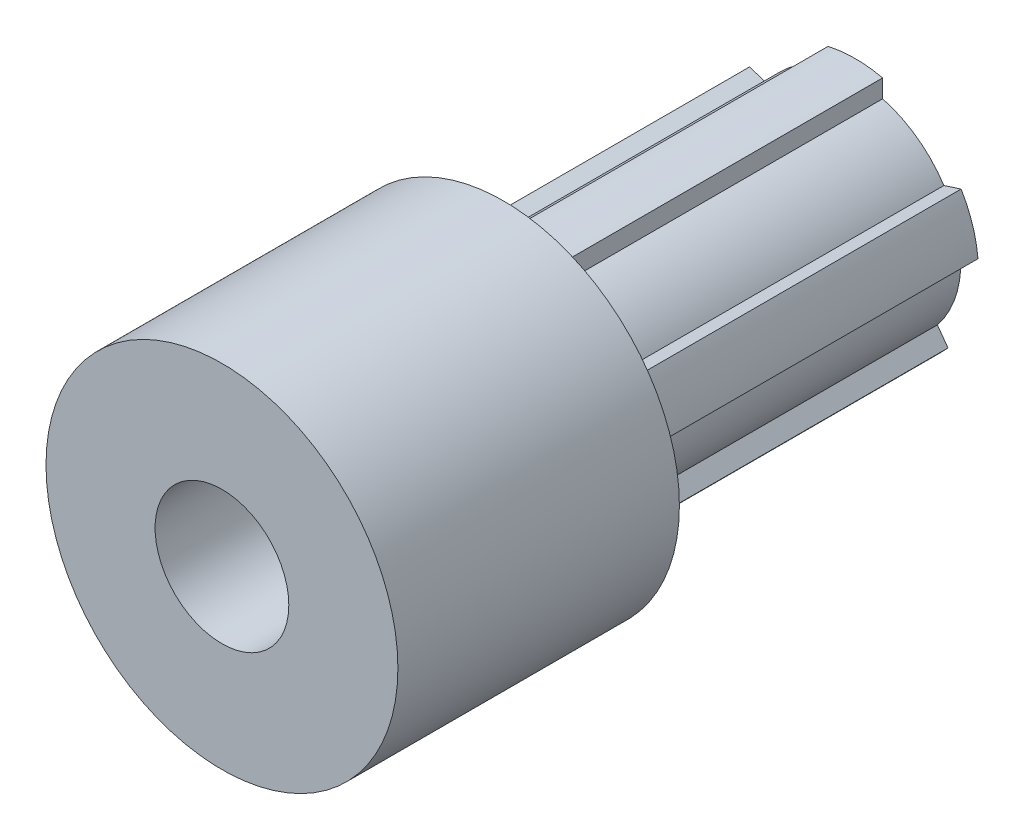
ISO-10303-21;
HEADER;
FILE_DESCRIPTION(('STEP AP214'),'2;1');
FILE_NAME('part.step','',(''),(''),'','','');
FILE_SCHEMA(('AUTOMOTIVE_DESIGN { 1 0 10303 214 1 1 1 1 }'));
ENDSEC;
DATA;
#1=APPLICATION_CONTEXT('core data for automotive mechanical design processes');
#2=APPLICATION_PROTOCOL_DEFINITION('international standard','automotive_design',2000,#1);
#3=PRODUCT_CONTEXT('',#1,'mechanical');
#4=PRODUCT('Part','Part','',(#3));
#5=PRODUCT_RELATED_PRODUCT_CATEGORY('part','',(#4));
#6=PRODUCT_DEFINITION_FORMATION('','',#4);
#7=PRODUCT_DEFINITION_CONTEXT('part definition',#1,'design');
#8=PRODUCT_DEFINITION('design','',#6,#7);
#9=PRODUCT_DEFINITION_SHAPE('','',#8);
#10=(LENGTH_UNIT() NAMED_UNIT(*) SI_UNIT(.MILLI.,.METRE.));
#11=(NAMED_UNIT(*) PLANE_ANGLE_UNIT() SI_UNIT($,.RADIAN.));
#12=(NAMED_UNIT(*) SI_UNIT($,.STERADIAN.) SOLID_ANGLE_UNIT());
#13=UNCERTAINTY_MEASURE_WITH_UNIT(LENGTH_MEASURE(1.E-05),#10,'distance_accuracy_value','');
#14=(GEOMETRIC_REPRESENTATION_CONTEXT(3) GLOBAL_UNCERTAINTY_ASSIGNED_CONTEXT((#13)) GLOBAL_UNIT_ASSIGNED_CONTEXT((#10,
#11,#12)) REPRESENTATION_CONTEXT('',''));
#15=CARTESIAN_POINT('',(0.,0.,0.));
#16=DIRECTION('',(0.,0.,1.));
#17=DIRECTION('',(1.,0.,0.));
#18=AXIS2_PLACEMENT_3D('',#15,#16,#17);
#19=CARTESIAN_POINT('',(0.,0.,60.8));
#20=DIRECTION('',(0.,0.,1.));
#21=DIRECTION('',(1.,0.,0.));
#22=AXIS2_PLACEMENT_3D('',#19,#20,#21);
#23=CYLINDRICAL_SURFACE('',#22,9.5);
#24=CARTESIAN_POINT('',(0.,0.,90.));
#25=DIRECTION('',(0.,0.,1.));
#26=DIRECTION('',(1.,0.,0.));
#27=AXIS2_PLACEMENT_3D('',#24,#25,#26);
#28=CIRCLE('',#27,9.5);
#29=CARTESIAN_POINT('',(9.5,0.,90.));
#30=VERTEX_POINT('',#29);
#31=EDGE_CURVE('E257',#30,#30,#28,.T.);
#32=ORIENTED_EDGE('',*,*,#31,.T.);
#33=EDGE_LOOP('',(#32));
#34=FACE_BOUND('',#33,.T.);
#35=DIRECTION('',(0.,0.,1.));
#36=VECTOR('',#35,1.);
#37=CARTESIAN_POINT('',(3.,9.01387818865997,60.8));
#38=LINE('',#37,#36);
#39=CARTESIAN_POINT('',(3.,9.01387818865997,60.8));
#40=VERTEX_POINT('',#39);
#41=CARTESIAN_POINT('',(3.,9.01387818865997,82.2));
#42=VERTEX_POINT('',#41);
#43=EDGE_CURVE('E243',#40,#42,#38,.T.);
#44=ORIENTED_EDGE('',*,*,#43,.F.);
#45=CARTESIAN_POINT('',(0.,0.,60.8));
#46=DIRECTION('',(0.,0.,1.));
#47=DIRECTION('',(1.,0.,0.));
#48=AXIS2_PLACEMENT_3D('',#45,#46,#47);
#49=CIRCLE('',#48,9.5);
#50=CARTESIAN_POINT('',(-3.,9.01387818865997,60.8));
#51=VERTEX_POINT('',#50);
#52=EDGE_CURVE('E258',#51,#40,#49,.T.);
#53=ORIENTED_EDGE('',*,*,#52,.F.);
#54=DIRECTION('',(0.,0.,1.));
#55=VECTOR('',#54,1.);
#56=CARTESIAN_POINT('',(-3.,9.01387818865997,60.8));
#57=LINE('',#56,#55);
#58=CARTESIAN_POINT('',(-3.,9.01387818865997,82.2));
#59=VERTEX_POINT('',#58);
#60=EDGE_CURVE('E245',#59,#51,#57,.F.);
#61=ORIENTED_EDGE('',*,*,#60,.F.);
#62=CARTESIAN_POINT('',(3.,9.01387818865997,82.2));
#63=CARTESIAN_POINT('',(3.00001051385875,9.0138659797526,82.2821115960639));
#64=CARTESIAN_POINT('',(2.99662905660005,9.01499989454477,82.3642162817493));
#65=CARTESIAN_POINT('',(2.98316404654784,9.01946917046719,82.5277943400374));
#66=CARTESIAN_POINT('',(2.97308213853191,9.02280399133373,82.6092678626093));
#67=CARTESIAN_POINT('',(2.94633448610861,9.03157240009613,82.7707866587447));
#68=CARTESIAN_POINT('',(2.92968675404813,9.03700024519574,82.8508352187801));
#69=CARTESIAN_POINT('',(2.88997412625352,9.04977799868353,83.0091467122218));
#70=CARTESIAN_POINT('',(2.86690903351726,9.05712796607721,83.0874095907309));
#71=CARTESIAN_POINT('',(2.78838156526383,9.08173850222865,83.3186413211253));
#72=CARTESIAN_POINT('',(2.72354999703843,9.10157261467588,83.4682741608753));
#73=CARTESIAN_POINT('',(2.57094386716857,9.14584733119862,83.7545497418246));
#74=CARTESIAN_POINT('',(2.48315705146955,9.17029039369115,83.8911854915794));
#75=CARTESIAN_POINT('',(2.2838388747468,9.22198403617595,84.1524081667219));
#76=CARTESIAN_POINT('',(2.17164444485387,9.24929895371902,84.2764774535989));
#77=CARTESIAN_POINT('',(1.92811437393957,9.30311268555823,84.5043874875414));
#78=CARTESIAN_POINT('',(1.79677542963294,9.32961135805786,84.6082247364356));
#79=CARTESIAN_POINT('',(1.51492697197699,9.3795477999587,84.7950383500792));
#80=CARTESIAN_POINT('',(1.36404405189943,9.40290050967596,84.8774761453684));
#81=CARTESIAN_POINT('',(1.04969762524301,9.44315613757947,85.015596867648));
#82=CARTESIAN_POINT('',(0.886237652558048,9.46006085962261,85.071287278485));
#83=CARTESIAN_POINT('',(0.556831203418088,9.48505937073961,85.1525930196885));
#84=CARTESIAN_POINT('',(0.391124861418227,9.49341369798659,85.1790996588489));
#85=CARTESIAN_POINT('',(0.0574168559885923,9.50129109936277,85.2041110455853));
#86=CARTESIAN_POINT('',(-0.110584313695127,9.50081604418683,85.2026217247077));
#87=CARTESIAN_POINT('',(-0.437828173835962,9.49126851976805,85.1722655146535));
#88=CARTESIAN_POINT('',(-0.597170843199378,9.48249971513205,85.1443655846099));
#89=CARTESIAN_POINT('',(-0.908782395328045,9.45772480432466,85.0635690606951));
#90=CARTESIAN_POINT('',(-1.06105089506543,9.44171830677393,85.0106711150454));
#91=CARTESIAN_POINT('',(-1.35640803150264,9.40386197703309,84.880767354096));
#92=CARTESIAN_POINT('',(-1.4993594227709,9.38194214767498,84.8034707307093));
#93=CARTESIAN_POINT('',(-1.77055948131571,9.33456474814701,84.6271982474181));
#94=CARTESIAN_POINT('',(-1.8988045031732,9.309106304269,84.5282170299507));
#95=CARTESIAN_POINT('',(-2.14270544761004,9.25608223599561,84.3064468791733));
#96=CARTESIAN_POINT('',(-2.25759649164401,9.22847303653709,84.1828260839732));
#97=CARTESIAN_POINT('',(-2.46526929661821,9.17518254568078,83.9177872091504));
#98=CARTESIAN_POINT('',(-2.55804433064725,9.14950184248643,83.776363734516));
#99=CARTESIAN_POINT('',(-2.71978065912097,9.10274637641722,83.4775051791214));
#100=CARTESIAN_POINT('',(-2.7884391865111,9.08173131348828,83.3198965627582));
#101=CARTESIAN_POINT('',(-2.89791755194282,9.04739847439929,82.9946131192133));
#102=CARTESIAN_POINT('',(-2.93878053127324,9.0340687747604,82.8269543330248));
#103=CARTESIAN_POINT('',(-2.97664323444399,9.02162485672095,82.5814118065919));
#104=CARTESIAN_POINT('',(-2.98539986566241,9.01872707446656,82.5053703596187));
#105=CARTESIAN_POINT('',(-2.99707362962925,9.01485301694164,82.3528991195762));
#106=CARTESIAN_POINT('',(-2.99999890907284,9.01387406100515,82.2764700180501));
#107=CARTESIAN_POINT('',(-3.,9.01387818865997,82.2));
#108=B_SPLINE_CURVE_WITH_KNOTS('',3,(#62,#63,#64,#65,#66,#67,#68,#69,#70,#71,#72,#73,#74,#75,
#76,#77,#78,#79,#80,#81,#82,#83,#84,#85,#86,#87,#88,#89,#90,#91,#92,#93,#94,#95,#96,#97,#98,#99,
#100,#101,#102,#103,#104,#105,#106,#107),.UNSPECIFIED.,.F.,.F.,(4,2,2,2,2,2,2,2,2,2,2,2,2,2,2,2,
2,2,2,2,2,2,4),(0.,0.246245637852737,0.492430851444295,0.737945339070648,0.983467364408598,
1.47384684625802,1.9644886406001,2.47064554646562,2.9768898906507,3.49485361930967,
4.01267233855413,4.51419531016909,5.01561202455114,5.49935290070998,5.98311993835788,
6.47288577409975,6.96277275190331,7.47344235565184,7.98426708947911,8.50129313971747,
9.01751487485063,9.24710313086509,9.4763704149835),.UNSPECIFIED.);
#109=EDGE_CURVE('E11',#42,#59,#108,.T.);
#110=ORIENTED_EDGE('',*,*,#109,.F.);
#111=EDGE_LOOP('',(#44,#53,#61,#110));
#112=FACE_BOUND('',#111,.T.);
#113=ADVANCED_FACE('F39',(#34,#112),#23,.F.);
#114=CARTESIAN_POINT('',(0.,0.,60.8));
#115=DIRECTION('',(0.,0.,1.));
#116=DIRECTION('',(1.,0.,0.));
#117=AXIS2_PLACEMENT_3D('',#114,#115,#116);
#118=PLANE('',#117);
#119=ORIENTED_EDGE('',*,*,#52,.T.);
#120=DIRECTION('',(0.,-1.,0.));
#121=VECTOR('',#120,1.);
#122=CARTESIAN_POINT('',(3.,0.,60.8));
#123=LINE('',#122,#121);
#124=CARTESIAN_POINT('',(3.,6.68,60.8));
#125=VERTEX_POINT('',#124);
#126=EDGE_CURVE('E54',#40,#125,#123,.T.);
#127=ORIENTED_EDGE('',*,*,#126,.T.);
#128=DIRECTION('',(-1.,0.,0.));
#129=VECTOR('',#128,1.);
#130=CARTESIAN_POINT('',(0.,6.68,60.8));
#131=LINE('',#130,#129);
#132=CARTESIAN_POINT('',(-3.,6.68,60.8));
#133=VERTEX_POINT('',#132);
#134=EDGE_CURVE('E453',#125,#133,#131,.T.);
#135=ORIENTED_EDGE('',*,*,#134,.T.);
#136=DIRECTION('',(0.,1.,0.));
#137=VECTOR('',#136,1.);
#138=CARTESIAN_POINT('',(-3.,0.,60.8));
#139=LINE('',#138,#137);
#140=EDGE_CURVE('E457',#133,#51,#139,.T.);
#141=ORIENTED_EDGE('',*,*,#140,.T.);
#142=EDGE_LOOP('',(#119,#127,#135,#141));
#143=FACE_BOUND('',#142,.T.);
#144=ADVANCED_FACE('F463',(#143),#118,.T.);
#145=CARTESIAN_POINT('',(0.,0.,50.));
#146=DIRECTION('',(0.,0.,-1.));
#147=DIRECTION('',(-1.,0.,0.));
#148=AXIS2_PLACEMENT_3D('',#145,#146,#147);
#149=CYLINDRICAL_SURFACE('',#148,17.5);
#150=CARTESIAN_POINT('',(0.,0.,0.));
#151=DIRECTION('',(0.,0.,-1.));
#152=DIRECTION('',(-1.,0.,0.));
#153=AXIS2_PLACEMENT_3D('',#150,#151,#152);
#154=CIRCLE('',#153,17.5);
#155=CARTESIAN_POINT('',(-3.88,17.0644542836857,0.));
#156=VERTEX_POINT('',#155);
#157=CARTESIAN_POINT('',(3.88,17.0644542836857,0.));
#158=VERTEX_POINT('',#157);
#159=EDGE_CURVE('E449',#156,#158,#154,.T.);
#160=ORIENTED_EDGE('',*,*,#159,.F.);
#161=DIRECTION('',(0.,0.,-1.));
#162=VECTOR('',#161,1.);
#163=CARTESIAN_POINT('',(-3.88,17.0644542836857,50.));
#164=LINE('',#163,#162);
#165=CARTESIAN_POINT('',(-3.88,17.0644542836857,50.));
#166=VERTEX_POINT('',#165);
#167=EDGE_CURVE('E362',#166,#156,#164,.T.);
#168=ORIENTED_EDGE('',*,*,#167,.F.);
#169=CARTESIAN_POINT('',(0.,0.,50.));
#170=DIRECTION('',(0.,0.,-1.));
#171=DIRECTION('',(-1.,0.,0.));
#172=AXIS2_PLACEMENT_3D('',#169,#170,#171);
#173=CIRCLE('',#172,17.5);
#174=CARTESIAN_POINT('',(3.88,17.0644542836857,50.));
#175=VERTEX_POINT('',#174);
#176=EDGE_CURVE('E439',#166,#175,#173,.T.);
#177=ORIENTED_EDGE('',*,*,#176,.T.);
#178=DIRECTION('',(0.,0.,-1.));
#179=VECTOR('',#178,1.);
#180=CARTESIAN_POINT('',(3.88,17.0644542836857,50.));
#181=LINE('',#180,#179);
#182=EDGE_CURVE('E411',#175,#158,#181,.T.);
#183=ORIENTED_EDGE('',*,*,#182,.T.);
#184=EDGE_LOOP('',(#160,#168,#177,#183));
#185=FACE_BOUND('',#184,.T.);
#186=ADVANCED_FACE('F504',(#185),#149,.T.);
#187=DIRECTION('',(0.,0.,-1.));
#188=VECTOR('',#187,1.);
#189=CARTESIAN_POINT('',(-15.0302745053453,8.96330565661841,50.));
#190=LINE('',#189,#188);
#191=CARTESIAN_POINT('',(-15.0302745053453,8.96330565661841,50.));
#192=VERTEX_POINT('',#191);
#193=CARTESIAN_POINT('',(-15.0302745053453,8.96330565661841,0.));
#194=VERTEX_POINT('',#193);
#195=EDGE_CURVE('E343',#192,#194,#190,.T.);
#196=ORIENTED_EDGE('',*,*,#195,.T.);
#197=CARTESIAN_POINT('',(-17.4282463816949,1.58310709016802,0.));
#198=VERTEX_POINT('',#197);
#199=EDGE_CURVE('E445',#198,#194,#154,.T.);
#200=ORIENTED_EDGE('',*,*,#199,.F.);
#201=DIRECTION('',(0.,0.,-1.));
#202=VECTOR('',#201,1.);
#203=CARTESIAN_POINT('',(-17.4282463816949,1.58310709016802,50.));
#204=LINE('',#203,#202);
#205=CARTESIAN_POINT('',(-17.4282463816949,1.58310709016802,50.));
#206=VERTEX_POINT('',#205);
#207=EDGE_CURVE('E394',#206,#198,#204,.T.);
#208=ORIENTED_EDGE('',*,*,#207,.F.);
#209=EDGE_CURVE('E434',#206,#192,#173,.T.);
#210=ORIENTED_EDGE('',*,*,#209,.T.);
#211=EDGE_LOOP('',(#196,#200,#208,#210));
#212=FACE_BOUND('',#211,.T.);
#213=ADVANCED_FACE('F589',(#212),#149,.T.);
#214=DIRECTION('',(0.,0.,-1.));
#215=VECTOR('',#214,1.);
#216=CARTESIAN_POINT('',(-13.1692205045443,-11.5248267363414,50.));
#217=LINE('',#216,#215);
#218=CARTESIAN_POINT('',(-13.1692205045443,-11.5248267363414,50.));
#219=VERTEX_POINT('',#218);
#220=CARTESIAN_POINT('',(-13.1692205045443,-11.5248267363414,0.));
#221=VERTEX_POINT('',#220);
#222=EDGE_CURVE('E379',#219,#221,#217,.T.);
#223=ORIENTED_EDGE('',*,*,#222,.T.);
#224=CARTESIAN_POINT('',(-6.89124862819471,-16.086040294131,0.));
#225=VERTEX_POINT('',#224);
#226=EDGE_CURVE('E424',#225,#221,#154,.T.);
#227=ORIENTED_EDGE('',*,*,#226,.F.);
#228=DIRECTION('',(0.,0.,-1.));
#229=VECTOR('',#228,1.);
#230=CARTESIAN_POINT('',(-6.8912486281947,-16.086040294131,50.));
#231=LINE('',#230,#229);
#232=CARTESIAN_POINT('',(-6.8912486281947,-16.086040294131,50.));
#233=VERTEX_POINT('',#232);
#234=EDGE_CURVE('E69',#233,#225,#231,.T.);
#235=ORIENTED_EDGE('',*,*,#234,.F.);
#236=EDGE_CURVE('E440',#233,#219,#173,.T.);
#237=ORIENTED_EDGE('',*,*,#236,.T.);
#238=EDGE_LOOP('',(#223,#227,#235,#237));
#239=FACE_BOUND('',#238,.T.);
#240=ADVANCED_FACE('F622',(#239),#149,.T.);
#241=DIRECTION('',(0.,0.,-1.));
#242=VECTOR('',#241,1.);
#243=CARTESIAN_POINT('',(6.89124862819494,-16.0860402941309,50.));
#244=LINE('',#243,#242);
#245=CARTESIAN_POINT('',(6.89124862819494,-16.0860402941309,50.));
#246=VERTEX_POINT('',#245);
#247=CARTESIAN_POINT('',(6.89124862819494,-16.0860402941309,0.));
#248=VERTEX_POINT('',#247);
#249=EDGE_CURVE('E277',#246,#248,#244,.T.);
#250=ORIENTED_EDGE('',*,*,#249,.T.);
#251=CARTESIAN_POINT('',(13.1692205045445,-11.5248267363412,0.));
#252=VERTEX_POINT('',#251);
#253=EDGE_CURVE('E610',#252,#248,#154,.T.);
#254=ORIENTED_EDGE('',*,*,#253,.F.);
#255=DIRECTION('',(0.,0.,-1.));
#256=VECTOR('',#255,1.);
#257=CARTESIAN_POINT('',(13.1692205045445,-11.5248267363412,50.));
#258=LINE('',#257,#256);
#259=CARTESIAN_POINT('',(13.1692205045445,-11.5248267363412,50.));
#260=VERTEX_POINT('',#259);
#261=EDGE_CURVE('E326',#260,#252,#258,.T.);
#262=ORIENTED_EDGE('',*,*,#261,.F.);
#263=EDGE_CURVE('E632',#260,#246,#173,.T.);
#264=ORIENTED_EDGE('',*,*,#263,.T.);
#265=EDGE_LOOP('',(#250,#254,#262,#264));
#266=FACE_BOUND('',#265,.T.);
#267=ADVANCED_FACE('F577',(#266),#149,.T.);
#268=CARTESIAN_POINT('',(0.,0.,90.));
#269=DIRECTION('',(0.,0.,-1.));
#270=DIRECTION('',(-1.,0.,0.));
#271=AXIS2_PLACEMENT_3D('',#268,#269,#270);
#272=CYLINDRICAL_SURFACE('',#271,25.);
#273=CARTESIAN_POINT('',(0.,0.,90.));
#274=DIRECTION('',(0.,0.,1.));
#275=DIRECTION('',(1.,0.,0.));
#276=AXIS2_PLACEMENT_3D('',#273,#274,#275);
#277=CIRCLE('',#276,25.);
#278=CARTESIAN_POINT('',(-25.,0.,90.));
#279=VERTEX_POINT('',#278);
#280=EDGE_CURVE('E444',#279,#279,#277,.T.);
#281=CARTESIAN_POINT('',(0.,0.,50.));
#282=DIRECTION('',(0.,0.,-1.));
#283=DIRECTION('',(-1.,0.,0.));
#284=AXIS2_PLACEMENT_3D('',#281,#282,#283);
#285=CIRCLE('',#284,25.);
#286=CARTESIAN_POINT('',(-25.,0.,50.));
#287=VERTEX_POINT('',#286);
#288=EDGE_CURVE('E438',#287,#287,#285,.T.);
#289=CARTESIAN_POINT('',(-25.,0.,90.));
#290=CARTESIAN_POINT('',(-25.,0.,89.5833333333333));
#291=CARTESIAN_POINT('',(-25.,0.,89.1666666666667));
#292=CARTESIAN_POINT('',(-25.,0.,88.3333333333333));
#293=CARTESIAN_POINT('',(-25.,0.,87.9166666666667));
#294=CARTESIAN_POINT('',(-25.,0.,87.0833333333333));
#295=CARTESIAN_POINT('',(-25.,0.,86.6666666666667));
#296=CARTESIAN_POINT('',(-25.,0.,85.8333333333333));
#297=CARTESIAN_POINT('',(-25.,0.,85.4166666666667));
#298=CARTESIAN_POINT('',(-25.,0.,84.5833333333333));
#299=CARTESIAN_POINT('',(-25.,0.,84.1666666666667));
#300=CARTESIAN_POINT('',(-25.,0.,83.3333333333333));
#301=CARTESIAN_POINT('',(-25.,0.,82.9166666666667));
#302=CARTESIAN_POINT('',(-25.,0.,82.0833333333333));
#303=CARTESIAN_POINT('',(-25.,0.,81.6666666666667));
#304=CARTESIAN_POINT('',(-25.,0.,80.8333333333333));
#305=CARTESIAN_POINT('',(-25.,0.,80.4166666666667));
#306=CARTESIAN_POINT('',(-25.,0.,79.5833333333333));
#307=CARTESIAN_POINT('',(-25.,0.,79.1666666666667));
#308=CARTESIAN_POINT('',(-25.,0.,78.3333333333333));
#309=CARTESIAN_POINT('',(-25.,0.,77.9166666666667));
#310=CARTESIAN_POINT('',(-25.,0.,77.0833333333333));
#311=CARTESIAN_POINT('',(-25.,0.,76.6666666666667));
#312=CARTESIAN_POINT('',(-25.,0.,75.8333333333333));
#313=CARTESIAN_POINT('',(-25.,0.,75.4166666666667));
#314=CARTESIAN_POINT('',(-25.,0.,74.5833333333333));
#315=CARTESIAN_POINT('',(-25.,0.,74.1666666666667));
#316=CARTESIAN_POINT('',(-25.,0.,73.3333333333333));
#317=CARTESIAN_POINT('',(-25.,0.,72.9166666666667));
#318=CARTESIAN_POINT('',(-25.,0.,72.0833333333333));
#319=CARTESIAN_POINT('',(-25.,0.,71.6666666666667));
#320=CARTESIAN_POINT('',(-25.,0.,70.8333333333333));
#321=CARTESIAN_POINT('',(-25.,0.,70.4166666666667));
#322=CARTESIAN_POINT('',(-25.,0.,69.5833333333333));
#323=CARTESIAN_POINT('',(-25.,0.,69.1666666666667));
#324=CARTESIAN_POINT('',(-25.,0.,68.3333333333333));
#325=CARTESIAN_POINT('',(-25.,0.,67.9166666666667));
#326=CARTESIAN_POINT('',(-25.,0.,67.0833333333333));
#327=CARTESIAN_POINT('',(-25.,0.,66.6666666666667));
#328=CARTESIAN_POINT('',(-25.,0.,65.8333333333333));
#329=CARTESIAN_POINT('',(-25.,0.,65.4166666666667));
#330=CARTESIAN_POINT('',(-25.,0.,64.5833333333333));
#331=CARTESIAN_POINT('',(-25.,0.,64.1666666666667));
#332=CARTESIAN_POINT('',(-25.,0.,63.3333333333333));
#333=CARTESIAN_POINT('',(-25.,0.,62.9166666666667));
#334=CARTESIAN_POINT('',(-25.,0.,62.0833333333333));
#335=CARTESIAN_POINT('',(-25.,0.,61.6666666666667));
#336=CARTESIAN_POINT('',(-25.,0.,60.8333333333333));
#337=CARTESIAN_POINT('',(-25.,0.,60.4166666666667));
#338=CARTESIAN_POINT('',(-25.,0.,59.5833333333333));
#339=CARTESIAN_POINT('',(-25.,0.,59.1666666666667));
#340=CARTESIAN_POINT('',(-25.,0.,58.3333333333333));
#341=CARTESIAN_POINT('',(-25.,0.,57.9166666666667));
#342=CARTESIAN_POINT('',(-25.,0.,57.0833333333333));
#343=CARTESIAN_POINT('',(-25.,0.,56.6666666666667));
#344=CARTESIAN_POINT('',(-25.,0.,55.8333333333333));
#345=CARTESIAN_POINT('',(-25.,0.,55.4166666666667));
#346=CARTESIAN_POINT('',(-25.,0.,54.5833333333333));
#347=CARTESIAN_POINT('',(-25.,0.,54.1666666666667));
#348=CARTESIAN_POINT('',(-25.,0.,53.3333333333333));
#349=CARTESIAN_POINT('',(-25.,0.,52.9166666666667));
#350=CARTESIAN_POINT('',(-25.,0.,52.0833333333333));
#351=CARTESIAN_POINT('',(-25.,0.,51.6666666666667));
#352=CARTESIAN_POINT('',(-25.,0.,50.8333333333333));
#353=CARTESIAN_POINT('',(-25.,0.,50.4166666666667));
#354=CARTESIAN_POINT('',(-25.,0.,50.));
#355=B_SPLINE_CURVE_WITH_KNOTS('',3,(#289,#290,#291,#292,#293,#294,#295,#296,#297,#298,#299,
#300,#301,#302,#303,#304,#305,#306,#307,#308,#309,#310,#311,#312,#313,#314,#315,#316,#317,#318,
#319,#320,#321,#322,#323,#324,#325,#326,#327,#328,#329,#330,#331,#332,#333,#334,#335,#336,#337,
#338,#339,#340,#341,#342,#343,#344,#345,#346,#347,#348,#349,#350,#351,#352,#353,#354),
.UNSPECIFIED.,.F.,.F.,(4,2,2,2,2,2,2,2,2,2,2,2,2,2,2,2,2,2,2,2,2,2,2,2,2,2,2,2,2,2,2,2,4),(0.,
1.24999999999999,2.49999999999999,3.74999999999999,4.99999999999999,6.24999999999999,
7.49999999999999,8.74999999999999,9.99999999999999,11.25,12.5,13.75,15.,16.25,17.5,18.75,20.,
21.25,22.5,23.75,25.,26.25,27.5,28.75,30.,31.25,32.5,33.75,35.,36.25,37.5,38.75,40.),.UNSPECIFIED.);
#356=EDGE_CURVE('BSEAM41',#279,#287,#355,.T.);
#357=ORIENTED_EDGE('',*,*,#280,.F.);
#358=ORIENTED_EDGE('',*,*,#288,.F.);
#359=ORIENTED_EDGE('',*,*,#356,.T.);
#360=ORIENTED_EDGE('',*,*,#356,.F.);
#361=EDGE_LOOP('',(#357,#359,#358,#360));
#362=FACE_BOUND('',#361,.T.);
#363=ADVANCED_FACE('F41',(#362),#272,.T.);
#364=CARTESIAN_POINT('',(0.,0.,90.));
#365=DIRECTION('',(0.,0.,1.));
#366=DIRECTION('',(1.,0.,0.));
#367=AXIS2_PLACEMENT_3D('',#364,#365,#366);
#368=PLANE('',#367);
#369=ORIENTED_EDGE('',*,*,#31,.F.);
#370=EDGE_LOOP('',(#369));
#371=FACE_BOUND('',#370,.T.);
#372=ORIENTED_EDGE('',*,*,#280,.T.);
#373=EDGE_LOOP('',(#372));
#374=FACE_BOUND('',#373,.T.);
#375=ADVANCED_FACE('F575',(#371,#374),#368,.T.);
#376=DIRECTION('',(0.,0.,-1.));
#377=VECTOR('',#376,1.);
#378=CARTESIAN_POINT('',(17.4282463816948,1.58310709016826,50.));
#379=LINE('',#378,#377);
#380=CARTESIAN_POINT('',(17.4282463816948,1.58310709016826,50.));
#381=VERTEX_POINT('',#380);
#382=CARTESIAN_POINT('',(17.4282463816948,1.58310709016826,0.));
#383=VERTEX_POINT('',#382);
#384=EDGE_CURVE('E311',#381,#383,#379,.T.);
#385=ORIENTED_EDGE('',*,*,#384,.T.);
#386=CARTESIAN_POINT('',(15.0302745053452,8.96330565661863,0.));
#387=VERTEX_POINT('',#386);
#388=EDGE_CURVE('E607',#387,#383,#154,.T.);
#389=ORIENTED_EDGE('',*,*,#388,.F.);
#390=DIRECTION('',(0.,0.,-1.));
#391=VECTOR('',#390,1.);
#392=CARTESIAN_POINT('',(15.0302745053452,8.96330565661863,50.));
#393=LINE('',#392,#391);
#394=CARTESIAN_POINT('',(15.0302745053452,8.96330565661863,50.));
#395=VERTEX_POINT('',#394);
#396=EDGE_CURVE('E428',#395,#387,#393,.T.);
#397=ORIENTED_EDGE('',*,*,#396,.F.);
#398=EDGE_CURVE('E635',#395,#381,#173,.T.);
#399=ORIENTED_EDGE('',*,*,#398,.T.);
#400=EDGE_LOOP('',(#385,#389,#397,#399));
#401=FACE_BOUND('',#400,.T.);
#402=ADVANCED_FACE('F571',(#401),#149,.T.);
#403=CARTESIAN_POINT('',(0.,0.,50.));
#404=DIRECTION('',(0.,0.,-1.));
#405=DIRECTION('',(-1.,0.,0.));
#406=AXIS2_PLACEMENT_3D('',#403,#404,#405);
#407=PLANE('',#406);
#408=ORIENTED_EDGE('',*,*,#209,.F.);
#409=DIRECTION('',(-0.951056516295155,0.309016994374944,0.));
#410=VECTOR('',#409,1.);
#411=CARTESIAN_POINT('',(-1.19898593817478,-3.69009928322519,50.));
#412=LINE('',#411,#410);
#413=CARTESIAN_POINT('',(-14.9793189946405,0.787402347469889,50.));
#414=VERTEX_POINT('',#413);
#415=EDGE_CURVE('E372',#414,#206,#412,.T.);
#416=ORIENTED_EDGE('',*,*,#415,.F.);
#417=CARTESIAN_POINT('',(0.,0.,50.));
#418=DIRECTION('',(0.,0.,-1.));
#419=DIRECTION('',(-1.,0.,0.));
#420=AXIS2_PLACEMENT_3D('',#417,#418,#419);
#421=CIRCLE('',#420,15.);
#422=CARTESIAN_POINT('',(-11.6557001433643,-9.44164467494819,50.));
#423=VERTEX_POINT('',#422);
#424=EDGE_CURVE('E376',#423,#414,#421,.T.);
#425=ORIENTED_EDGE('',*,*,#424,.F.);
#426=DIRECTION('',(-0.587785252292469,-0.809016994374951,0.));
#427=VECTOR('',#426,1.);
#428=CARTESIAN_POINT('',(-3.13898593817481,2.28060677889478,50.));
#429=LINE('',#428,#427);
#430=EDGE_CURVE('E368',#423,#219,#429,.T.);
#431=ORIENTED_EDGE('',*,*,#430,.T.);
#432=ORIENTED_EDGE('',*,*,#236,.F.);
#433=DIRECTION('',(-0.587785252292469,-0.809016994374951,0.));
#434=VECTOR('',#433,1.);
#435=CARTESIAN_POINT('',(3.13898593817481,-2.28060677889478,50.));
#436=LINE('',#435,#434);
#437=CARTESIAN_POINT('',(-5.37772826701468,-14.0028582327377,50.));
#438=VERTEX_POINT('',#437);
#439=EDGE_CURVE('E270',#438,#233,#436,.T.);
#440=ORIENTED_EDGE('',*,*,#439,.F.);
#441=CARTESIAN_POINT('',(0.,0.,50.));
#442=DIRECTION('',(0.,0.,-1.));
#443=DIRECTION('',(-1.,0.,0.));
#444=AXIS2_PLACEMENT_3D('',#441,#442,#443);
#445=CIRCLE('',#444,15.);
#446=CARTESIAN_POINT('',(5.37772826701488,-14.0028582327377,50.));
#447=VERTEX_POINT('',#446);
#448=EDGE_CURVE('E274',#447,#438,#445,.T.);
#449=ORIENTED_EDGE('',*,*,#448,.F.);
#450=DIRECTION('',(0.58778525229248,-0.809016994374942,0.));
#451=VECTOR('',#450,1.);
#452=CARTESIAN_POINT('',(-3.13898593817478,-2.28060677889482,50.));
#453=LINE('',#452,#451);
#454=EDGE_CURVE('E266',#447,#246,#453,.T.);
#455=ORIENTED_EDGE('',*,*,#454,.T.);
#456=ORIENTED_EDGE('',*,*,#263,.F.);
#457=DIRECTION('',(0.58778525229248,-0.809016994374942,0.));
#458=VECTOR('',#457,1.);
#459=CARTESIAN_POINT('',(3.13898593817478,2.28060677889482,50.));
#460=LINE('',#459,#458);
#461=CARTESIAN_POINT('',(11.6557001433644,-9.44164467494802,50.));
#462=VERTEX_POINT('',#461);
#463=EDGE_CURVE('E304',#462,#260,#460,.T.);
#464=ORIENTED_EDGE('',*,*,#463,.F.);
#465=CARTESIAN_POINT('',(0.,0.,50.));
#466=DIRECTION('',(0.,0.,-1.));
#467=DIRECTION('',(-1.,0.,0.));
#468=AXIS2_PLACEMENT_3D('',#465,#466,#467);
#469=CIRCLE('',#468,15.);
#470=CARTESIAN_POINT('',(14.9793189946405,0.787402347470103,50.));
#471=VERTEX_POINT('',#470);
#472=EDGE_CURVE('E308',#471,#462,#469,.T.);
#473=ORIENTED_EDGE('',*,*,#472,.F.);
#474=DIRECTION('',(0.95105651629515,0.309016994374958,0.));
#475=VECTOR('',#474,1.);
#476=CARTESIAN_POINT('',(1.19898593817484,-3.69009928322518,50.));
#477=LINE('',#476,#475);
#478=EDGE_CURVE('E300',#471,#381,#477,.T.);
#479=ORIENTED_EDGE('',*,*,#478,.T.);
#480=ORIENTED_EDGE('',*,*,#398,.F.);
#481=DIRECTION('',(0.95105651629515,0.309016994374959,0.));
#482=VECTOR('',#481,1.);
#483=CARTESIAN_POINT('',(-1.19898593817484,3.69009928322517,50.));
#484=LINE('',#483,#482);
#485=CARTESIAN_POINT('',(12.5813471182909,8.16760091392047,50.));
#486=VERTEX_POINT('',#485);
#487=EDGE_CURVE('E404',#486,#395,#484,.T.);
#488=ORIENTED_EDGE('',*,*,#487,.F.);
#489=CARTESIAN_POINT('',(0.,0.,50.));
#490=DIRECTION('',(0.,0.,-1.));
#491=DIRECTION('',(-1.,0.,0.));
#492=AXIS2_PLACEMENT_3D('',#489,#490,#491);
#493=CIRCLE('',#492,15.);
#494=CARTESIAN_POINT('',(3.88,14.4894996462956,50.));
#495=VERTEX_POINT('',#494);
#496=EDGE_CURVE('E408',#495,#486,#493,.T.);
#497=ORIENTED_EDGE('',*,*,#496,.F.);
#498=DIRECTION('',(0.,1.,0.));
#499=VECTOR('',#498,1.);
#500=CARTESIAN_POINT('',(3.88,0.,50.));
#501=LINE('',#500,#499);
#502=EDGE_CURVE('E400',#495,#175,#501,.T.);
#503=ORIENTED_EDGE('',*,*,#502,.T.);
#504=ORIENTED_EDGE('',*,*,#176,.F.);
#505=DIRECTION('',(0.,1.,0.));
#506=VECTOR('',#505,1.);
#507=CARTESIAN_POINT('',(-3.88,0.,50.));
#508=LINE('',#507,#506);
#509=CARTESIAN_POINT('',(-3.88,14.4894996462956,50.));
#510=VERTEX_POINT('',#509);
#511=EDGE_CURVE('E336',#510,#166,#508,.T.);
#512=ORIENTED_EDGE('',*,*,#511,.F.);
#513=CARTESIAN_POINT('',(0.,0.,50.));
#514=DIRECTION('',(0.,0.,-1.));
#515=DIRECTION('',(-1.,0.,0.));
#516=AXIS2_PLACEMENT_3D('',#513,#514,#515);
#517=CIRCLE('',#516,15.);
#518=CARTESIAN_POINT('',(-12.581347118291,8.16760091392029,50.));
#519=VERTEX_POINT('',#518);
#520=EDGE_CURVE('E340',#519,#510,#517,.T.);
#521=ORIENTED_EDGE('',*,*,#520,.F.);
#522=DIRECTION('',(-0.951056516295155,0.309016994374945,0.));
#523=VECTOR('',#522,1.);
#524=CARTESIAN_POINT('',(1.19898593817479,3.6900992832252,50.));
#525=LINE('',#524,#523);
#526=EDGE_CURVE('E332',#519,#192,#525,.T.);
#527=ORIENTED_EDGE('',*,*,#526,.T.);
#528=EDGE_LOOP('',(#408,#416,#425,#431,#432,#440,#449,#455,#456,#464,#473,#479,#480,#488,#497,
#503,#504,#512,#521,#527));
#529=FACE_BOUND('',#528,.T.);
#530=ORIENTED_EDGE('',*,*,#288,.T.);
#531=EDGE_LOOP('',(#530));
#532=FACE_BOUND('',#531,.T.);
#533=ADVANCED_FACE('F568',(#529,#532),#407,.T.);
#534=CARTESIAN_POINT('',(0.,0.,0.));
#535=DIRECTION('',(0.,0.,1.));
#536=DIRECTION('',(1.,0.,0.));
#537=AXIS2_PLACEMENT_3D('',#534,#535,#536);
#538=PLANE('',#537);
#539=ORIENTED_EDGE('',*,*,#199,.T.);
#540=DIRECTION('',(-0.951056516295155,0.309016994374945,0.));
#541=VECTOR('',#540,1.);
#542=CARTESIAN_POINT('',(1.19898593817479,3.6900992832252,0.));
#543=LINE('',#542,#541);
#544=CARTESIAN_POINT('',(-12.581347118291,8.16760091392029,0.));
#545=VERTEX_POINT('',#544);
#546=EDGE_CURVE('E344',#545,#194,#543,.T.);
#547=ORIENTED_EDGE('',*,*,#546,.F.);
#548=CARTESIAN_POINT('',(0.,0.,0.));
#549=DIRECTION('',(0.,0.,-1.));
#550=DIRECTION('',(-1.,0.,0.));
#551=AXIS2_PLACEMENT_3D('',#548,#549,#550);
#552=CIRCLE('',#551,15.);
#553=CARTESIAN_POINT('',(-3.88,14.4894996462956,0.));
#554=VERTEX_POINT('',#553);
#555=EDGE_CURVE('E337',#545,#554,#552,.T.);
#556=ORIENTED_EDGE('',*,*,#555,.T.);
#557=DIRECTION('',(0.,1.,0.));
#558=VECTOR('',#557,1.);
#559=CARTESIAN_POINT('',(-3.88,0.,0.));
#560=LINE('',#559,#558);
#561=EDGE_CURVE('E347',#554,#156,#560,.T.);
#562=ORIENTED_EDGE('',*,*,#561,.T.);
#563=ORIENTED_EDGE('',*,*,#159,.T.);
#564=DIRECTION('',(0.,1.,0.));
#565=VECTOR('',#564,1.);
#566=CARTESIAN_POINT('',(3.88,0.,0.));
#567=LINE('',#566,#565);
#568=CARTESIAN_POINT('',(3.88,14.4894996462956,0.));
#569=VERTEX_POINT('',#568);
#570=EDGE_CURVE('E358',#569,#158,#567,.T.);
#571=ORIENTED_EDGE('',*,*,#570,.F.);
#572=CARTESIAN_POINT('',(0.,0.,0.));
#573=DIRECTION('',(0.,0.,-1.));
#574=DIRECTION('',(-1.,0.,0.));
#575=AXIS2_PLACEMENT_3D('',#572,#573,#574);
#576=CIRCLE('',#575,15.);
#577=CARTESIAN_POINT('',(12.5813471182909,8.16760091392047,0.));
#578=VERTEX_POINT('',#577);
#579=EDGE_CURVE('E405',#569,#578,#576,.T.);
#580=ORIENTED_EDGE('',*,*,#579,.T.);
#581=DIRECTION('',(0.95105651629515,0.309016994374959,0.));
#582=VECTOR('',#581,1.);
#583=CARTESIAN_POINT('',(-1.19898593817484,3.69009928322517,0.));
#584=LINE('',#583,#582);
#585=EDGE_CURVE('E414',#578,#387,#584,.T.);
#586=ORIENTED_EDGE('',*,*,#585,.T.);
#587=ORIENTED_EDGE('',*,*,#388,.T.);
#588=DIRECTION('',(0.95105651629515,0.309016994374958,0.));
#589=VECTOR('',#588,1.);
#590=CARTESIAN_POINT('',(1.19898593817484,-3.69009928322518,0.));
#591=LINE('',#590,#589);
#592=CARTESIAN_POINT('',(14.9793189946405,0.787402347470103,0.));
#593=VERTEX_POINT('',#592);
#594=EDGE_CURVE('E262',#593,#383,#591,.T.);
#595=ORIENTED_EDGE('',*,*,#594,.F.);
#596=CARTESIAN_POINT('',(0.,0.,0.));
#597=DIRECTION('',(0.,0.,-1.));
#598=DIRECTION('',(-1.,0.,0.));
#599=AXIS2_PLACEMENT_3D('',#596,#597,#598);
#600=CIRCLE('',#599,15.);
#601=CARTESIAN_POINT('',(11.6557001433644,-9.44164467494802,0.));
#602=VERTEX_POINT('',#601);
#603=EDGE_CURVE('E305',#593,#602,#600,.T.);
#604=ORIENTED_EDGE('',*,*,#603,.T.);
#605=DIRECTION('',(0.58778525229248,-0.809016994374942,0.));
#606=VECTOR('',#605,1.);
#607=CARTESIAN_POINT('',(3.13898593817478,2.28060677889482,0.));
#608=LINE('',#607,#606);
#609=EDGE_CURVE('E314',#602,#252,#608,.T.);
#610=ORIENTED_EDGE('',*,*,#609,.T.);
#611=ORIENTED_EDGE('',*,*,#253,.T.);
#612=DIRECTION('',(0.58778525229248,-0.809016994374942,0.));
#613=VECTOR('',#612,1.);
#614=CARTESIAN_POINT('',(-3.13898593817478,-2.28060677889482,0.));
#615=LINE('',#614,#613);
#616=CARTESIAN_POINT('',(5.37772826701488,-14.0028582327377,0.));
#617=VERTEX_POINT('',#616);
#618=EDGE_CURVE('E278',#617,#248,#615,.T.);
#619=ORIENTED_EDGE('',*,*,#618,.F.);
#620=CARTESIAN_POINT('',(0.,0.,0.));
#621=DIRECTION('',(0.,0.,-1.));
#622=DIRECTION('',(-1.,0.,0.));
#623=AXIS2_PLACEMENT_3D('',#620,#621,#622);
#624=CIRCLE('',#623,15.);
#625=CARTESIAN_POINT('',(-5.37772826701468,-14.0028582327377,0.));
#626=VERTEX_POINT('',#625);
#627=EDGE_CURVE('E271',#617,#626,#624,.T.);
#628=ORIENTED_EDGE('',*,*,#627,.T.);
#629=DIRECTION('',(-0.587785252292469,-0.809016994374951,0.));
#630=VECTOR('',#629,1.);
#631=CARTESIAN_POINT('',(3.13898593817481,-2.28060677889478,0.));
#632=LINE('',#631,#630);
#633=EDGE_CURVE('E281',#626,#225,#632,.T.);
#634=ORIENTED_EDGE('',*,*,#633,.T.);
#635=ORIENTED_EDGE('',*,*,#226,.T.);
#636=DIRECTION('',(-0.587785252292469,-0.809016994374951,0.));
#637=VECTOR('',#636,1.);
#638=CARTESIAN_POINT('',(-3.13898593817481,2.28060677889478,0.));
#639=LINE('',#638,#637);
#640=CARTESIAN_POINT('',(-11.6557001433643,-9.44164467494819,0.));
#641=VERTEX_POINT('',#640);
#642=EDGE_CURVE('E291',#641,#221,#639,.T.);
#643=ORIENTED_EDGE('',*,*,#642,.F.);
#644=CARTESIAN_POINT('',(0.,0.,0.));
#645=DIRECTION('',(0.,0.,-1.));
#646=DIRECTION('',(-1.,0.,0.));
#647=AXIS2_PLACEMENT_3D('',#644,#645,#646);
#648=CIRCLE('',#647,15.);
#649=CARTESIAN_POINT('',(-14.9793189946405,0.787402347469889,0.));
#650=VERTEX_POINT('',#649);
#651=EDGE_CURVE('E373',#641,#650,#648,.T.);
#652=ORIENTED_EDGE('',*,*,#651,.T.);
#653=DIRECTION('',(-0.951056516295155,0.309016994374944,0.));
#654=VECTOR('',#653,1.);
#655=CARTESIAN_POINT('',(-1.19898593817478,-3.69009928322519,0.));
#656=LINE('',#655,#654);
#657=EDGE_CURVE('E382',#650,#198,#656,.T.);
#658=ORIENTED_EDGE('',*,*,#657,.T.);
#659=EDGE_LOOP('',(#539,#547,#556,#562,#563,#571,#580,#586,#587,#595,#604,#610,#611,#619,#628,
#634,#635,#643,#652,#658));
#660=FACE_BOUND('',#659,.T.);
#661=ADVANCED_FACE('F566',(#660),#538,.F.);
#662=CARTESIAN_POINT('',(3.88,0.,50.));
#663=DIRECTION('',(-1.,0.,0.));
#664=DIRECTION('',(0.,0.,1.));
#665=AXIS2_PLACEMENT_3D('',#662,#663,#664);
#666=PLANE('',#665);
#667=ORIENTED_EDGE('',*,*,#570,.T.);
#668=ORIENTED_EDGE('',*,*,#182,.F.);
#669=ORIENTED_EDGE('',*,*,#502,.F.);
#670=DIRECTION('',(0.,0.,-1.));
#671=VECTOR('',#670,1.);
#672=CARTESIAN_POINT('',(3.88,14.4894996462956,50.));
#673=LINE('',#672,#671);
#674=EDGE_CURVE('E421',#495,#569,#673,.T.);
#675=ORIENTED_EDGE('',*,*,#674,.T.);
#676=EDGE_LOOP('',(#667,#668,#669,#675));
#677=FACE_BOUND('',#676,.T.);
#678=ADVANCED_FACE('F559',(#677),#666,.F.);
#679=CARTESIAN_POINT('',(0.,0.,50.));
#680=DIRECTION('',(0.,0.,-1.));
#681=DIRECTION('',(-1.,0.,0.));
#682=AXIS2_PLACEMENT_3D('',#679,#680,#681);
#683=CYLINDRICAL_SURFACE('',#682,15.);
#684=ORIENTED_EDGE('',*,*,#579,.F.);
#685=ORIENTED_EDGE('',*,*,#674,.F.);
#686=ORIENTED_EDGE('',*,*,#496,.T.);
#687=DIRECTION('',(0.,0.,-1.));
#688=VECTOR('',#687,1.);
#689=CARTESIAN_POINT('',(12.5813471182909,8.16760091392047,50.));
#690=LINE('',#689,#688);
#691=EDGE_CURVE('E425',#486,#578,#690,.T.);
#692=ORIENTED_EDGE('',*,*,#691,.T.);
#693=EDGE_LOOP('',(#684,#685,#686,#692));
#694=FACE_BOUND('',#693,.T.);
#695=ADVANCED_FACE('F556',(#694),#683,.T.);
#696=CARTESIAN_POINT('',(-1.19898593817484,3.69009928322517,50.));
#697=DIRECTION('',(-0.309016994374959,0.95105651629515,0.));
#698=DIRECTION('',(-0.95105651629515,-0.309016994374959,0.));
#699=AXIS2_PLACEMENT_3D('',#696,#697,#698);
#700=PLANE('',#699);
#701=ORIENTED_EDGE('',*,*,#585,.F.);
#702=ORIENTED_EDGE('',*,*,#691,.F.);
#703=ORIENTED_EDGE('',*,*,#487,.T.);
#704=ORIENTED_EDGE('',*,*,#396,.T.);
#705=EDGE_LOOP('',(#701,#702,#703,#704));
#706=FACE_BOUND('',#705,.T.);
#707=ADVANCED_FACE('F531',(#706),#700,.T.);
#708=CARTESIAN_POINT('',(1.19898593817484,-3.69009928322518,50.));
#709=DIRECTION('',(-0.309016994374958,0.95105651629515,0.));
#710=DIRECTION('',(-0.95105651629515,-0.309016994374958,0.));
#711=AXIS2_PLACEMENT_3D('',#708,#709,#710);
#712=PLANE('',#711);
#713=ORIENTED_EDGE('',*,*,#594,.T.);
#714=ORIENTED_EDGE('',*,*,#384,.F.);
#715=ORIENTED_EDGE('',*,*,#478,.F.);
#716=DIRECTION('',(0.,0.,-1.));
#717=VECTOR('',#716,1.);
#718=CARTESIAN_POINT('',(14.9793189946405,0.787402347470103,50.));
#719=LINE('',#718,#717);
#720=EDGE_CURVE('E282',#471,#593,#719,.T.);
#721=ORIENTED_EDGE('',*,*,#720,.T.);
#722=EDGE_LOOP('',(#713,#714,#715,#721));
#723=FACE_BOUND('',#722,.T.);
#724=ADVANCED_FACE('F524',(#723),#712,.F.);
#725=CARTESIAN_POINT('',(0.,0.,50.));
#726=DIRECTION('',(0.,0.,-1.));
#727=DIRECTION('',(-1.,0.,0.));
#728=AXIS2_PLACEMENT_3D('',#725,#726,#727);
#729=CYLINDRICAL_SURFACE('',#728,15.);
#730=ORIENTED_EDGE('',*,*,#603,.F.);
#731=ORIENTED_EDGE('',*,*,#720,.F.);
#732=ORIENTED_EDGE('',*,*,#472,.T.);
#733=DIRECTION('',(0.,0.,-1.));
#734=VECTOR('',#733,1.);
#735=CARTESIAN_POINT('',(11.6557001433644,-9.44164467494802,50.));
#736=LINE('',#735,#734);
#737=EDGE_CURVE('E323',#462,#602,#736,.T.);
#738=ORIENTED_EDGE('',*,*,#737,.T.);
#739=EDGE_LOOP('',(#730,#731,#732,#738));
#740=FACE_BOUND('',#739,.T.);
#741=ADVANCED_FACE('F521',(#740),#729,.T.);
#742=CARTESIAN_POINT('',(3.13898593817478,2.28060677889482,50.));
#743=DIRECTION('',(0.809016994374942,0.58778525229248,0.));
#744=DIRECTION('',(-0.58778525229248,0.809016994374942,0.));
#745=AXIS2_PLACEMENT_3D('',#742,#743,#744);
#746=PLANE('',#745);
#747=ORIENTED_EDGE('',*,*,#609,.F.);
#748=ORIENTED_EDGE('',*,*,#737,.F.);
#749=ORIENTED_EDGE('',*,*,#463,.T.);
#750=ORIENTED_EDGE('',*,*,#261,.T.);
#751=EDGE_LOOP('',(#747,#748,#749,#750));
#752=FACE_BOUND('',#751,.T.);
#753=ADVANCED_FACE('F519',(#752),#746,.T.);
#754=CARTESIAN_POINT('',(-3.13898593817478,-2.28060677889482,50.));
#755=DIRECTION('',(0.809016994374942,0.58778525229248,0.));
#756=DIRECTION('',(-0.58778525229248,0.809016994374942,0.));
#757=AXIS2_PLACEMENT_3D('',#754,#755,#756);
#758=PLANE('',#757);
#759=ORIENTED_EDGE('',*,*,#618,.T.);
#760=ORIENTED_EDGE('',*,*,#249,.F.);
#761=ORIENTED_EDGE('',*,*,#454,.F.);
#762=DIRECTION('',(0.,0.,-1.));
#763=VECTOR('',#762,1.);
#764=CARTESIAN_POINT('',(5.37772826701488,-14.0028582327377,50.));
#765=LINE('',#764,#763);
#766=EDGE_CURVE('E288',#447,#617,#765,.T.);
#767=ORIENTED_EDGE('',*,*,#766,.T.);
#768=EDGE_LOOP('',(#759,#760,#761,#767));
#769=FACE_BOUND('',#768,.T.);
#770=ADVANCED_FACE('F512',(#769),#758,.F.);
#771=CARTESIAN_POINT('',(0.,0.,50.));
#772=DIRECTION('',(0.,0.,-1.));
#773=DIRECTION('',(-1.,0.,0.));
#774=AXIS2_PLACEMENT_3D('',#771,#772,#773);
#775=CYLINDRICAL_SURFACE('',#774,15.);
#776=ORIENTED_EDGE('',*,*,#627,.F.);
#777=ORIENTED_EDGE('',*,*,#766,.F.);
#778=ORIENTED_EDGE('',*,*,#448,.T.);
#779=DIRECTION('',(0.,0.,-1.));
#780=VECTOR('',#779,1.);
#781=CARTESIAN_POINT('',(-5.37772826701468,-14.0028582327377,50.));
#782=LINE('',#781,#780);
#783=EDGE_CURVE('E292',#438,#626,#782,.T.);
#784=ORIENTED_EDGE('',*,*,#783,.T.);
#785=EDGE_LOOP('',(#776,#777,#778,#784));
#786=FACE_BOUND('',#785,.T.);
#787=ADVANCED_FACE('F508',(#786),#775,.T.);
#788=CARTESIAN_POINT('',(3.13898593817481,-2.28060677889478,50.));
#789=DIRECTION('',(0.80901699437495,-0.587785252292469,0.));
#790=DIRECTION('',(0.587785252292469,0.809016994374951,0.));
#791=AXIS2_PLACEMENT_3D('',#788,#789,#790);
#792=PLANE('',#791);
#793=ORIENTED_EDGE('',*,*,#633,.F.);
#794=ORIENTED_EDGE('',*,*,#783,.F.);
#795=ORIENTED_EDGE('',*,*,#439,.T.);
#796=ORIENTED_EDGE('',*,*,#234,.T.);
#797=EDGE_LOOP('',(#793,#794,#795,#796));
#798=FACE_BOUND('',#797,.T.);
#799=ADVANCED_FACE('F511',(#798),#792,.T.);
#800=CARTESIAN_POINT('',(-3.13898593817481,2.28060677889478,50.));
#801=DIRECTION('',(0.809016994374951,-0.587785252292469,0.));
#802=DIRECTION('',(0.587785252292469,0.809016994374951,0.));
#803=AXIS2_PLACEMENT_3D('',#800,#801,#802);
#804=PLANE('',#803);
#805=ORIENTED_EDGE('',*,*,#642,.T.);
#806=ORIENTED_EDGE('',*,*,#222,.F.);
#807=ORIENTED_EDGE('',*,*,#430,.F.);
#808=DIRECTION('',(0.,0.,-1.));
#809=VECTOR('',#808,1.);
#810=CARTESIAN_POINT('',(-11.6557001433643,-9.44164467494819,50.));
#811=LINE('',#810,#809);
#812=EDGE_CURVE('E348',#423,#641,#811,.T.);
#813=ORIENTED_EDGE('',*,*,#812,.T.);
#814=EDGE_LOOP('',(#805,#806,#807,#813));
#815=FACE_BOUND('',#814,.T.);
#816=ADVANCED_FACE('F516',(#815),#804,.F.);
#817=CARTESIAN_POINT('',(0.,0.,50.));
#818=DIRECTION('',(0.,0.,-1.));
#819=DIRECTION('',(-1.,0.,0.));
#820=AXIS2_PLACEMENT_3D('',#817,#818,#819);
#821=CYLINDRICAL_SURFACE('',#820,15.);
#822=ORIENTED_EDGE('',*,*,#651,.F.);
#823=ORIENTED_EDGE('',*,*,#812,.F.);
#824=ORIENTED_EDGE('',*,*,#424,.T.);
#825=DIRECTION('',(0.,0.,-1.));
#826=VECTOR('',#825,1.);
#827=CARTESIAN_POINT('',(-14.9793189946405,0.787402347469889,50.));
#828=LINE('',#827,#826);
#829=EDGE_CURVE('E391',#414,#650,#828,.T.);
#830=ORIENTED_EDGE('',*,*,#829,.T.);
#831=EDGE_LOOP('',(#822,#823,#824,#830));
#832=FACE_BOUND('',#831,.T.);
#833=ADVANCED_FACE('F546',(#832),#821,.T.);
#834=CARTESIAN_POINT('',(-1.19898593817478,-3.69009928322519,50.));
#835=DIRECTION('',(-0.309016994374944,-0.951056516295155,0.));
#836=DIRECTION('',(0.951056516295155,-0.309016994374944,0.));
#837=AXIS2_PLACEMENT_3D('',#834,#835,#836);
#838=PLANE('',#837);
#839=ORIENTED_EDGE('',*,*,#657,.F.);
#840=ORIENTED_EDGE('',*,*,#829,.F.);
#841=ORIENTED_EDGE('',*,*,#415,.T.);
#842=ORIENTED_EDGE('',*,*,#207,.T.);
#843=EDGE_LOOP('',(#839,#840,#841,#842));
#844=FACE_BOUND('',#843,.T.);
#845=ADVANCED_FACE('F544',(#844),#838,.T.);
#846=CARTESIAN_POINT('',(1.19898593817479,3.6900992832252,50.));
#847=DIRECTION('',(-0.309016994374945,-0.951056516295155,0.));
#848=DIRECTION('',(0.951056516295155,-0.309016994374945,0.));
#849=AXIS2_PLACEMENT_3D('',#846,#847,#848);
#850=PLANE('',#849);
#851=ORIENTED_EDGE('',*,*,#546,.T.);
#852=ORIENTED_EDGE('',*,*,#195,.F.);
#853=ORIENTED_EDGE('',*,*,#526,.F.);
#854=DIRECTION('',(0.,0.,-1.));
#855=VECTOR('',#854,1.);
#856=CARTESIAN_POINT('',(-12.581347118291,8.16760091392029,50.));
#857=LINE('',#856,#855);
#858=EDGE_CURVE('E355',#519,#545,#857,.T.);
#859=ORIENTED_EDGE('',*,*,#858,.T.);
#860=EDGE_LOOP('',(#851,#852,#853,#859));
#861=FACE_BOUND('',#860,.T.);
#862=ADVANCED_FACE('F537',(#861),#850,.F.);
#863=CARTESIAN_POINT('',(0.,0.,50.));
#864=DIRECTION('',(0.,0.,-1.));
#865=DIRECTION('',(-1.,0.,0.));
#866=AXIS2_PLACEMENT_3D('',#863,#864,#865);
#867=CYLINDRICAL_SURFACE('',#866,15.);
#868=ORIENTED_EDGE('',*,*,#555,.F.);
#869=ORIENTED_EDGE('',*,*,#858,.F.);
#870=ORIENTED_EDGE('',*,*,#520,.T.);
#871=DIRECTION('',(0.,0.,-1.));
#872=VECTOR('',#871,1.);
#873=CARTESIAN_POINT('',(-3.88,14.4894996462956,50.));
#874=LINE('',#873,#872);
#875=EDGE_CURVE('E359',#510,#554,#874,.T.);
#876=ORIENTED_EDGE('',*,*,#875,.T.);
#877=EDGE_LOOP('',(#868,#869,#870,#876));
#878=FACE_BOUND('',#877,.T.);
#879=ADVANCED_FACE('F533',(#878),#867,.T.);
#880=CARTESIAN_POINT('',(-3.88,0.,50.));
#881=DIRECTION('',(-1.,0.,0.));
#882=DIRECTION('',(0.,0.,1.));
#883=AXIS2_PLACEMENT_3D('',#880,#881,#882);
#884=PLANE('',#883);
#885=ORIENTED_EDGE('',*,*,#561,.F.);
#886=ORIENTED_EDGE('',*,*,#875,.F.);
#887=ORIENTED_EDGE('',*,*,#511,.T.);
#888=ORIENTED_EDGE('',*,*,#167,.T.);
#889=EDGE_LOOP('',(#885,#886,#887,#888));
#890=FACE_BOUND('',#889,.T.);
#891=ADVANCED_FACE('F536',(#890),#884,.T.);
#892=CARTESIAN_POINT('',(0.,10.68,82.2));
#893=DIRECTION('',(0.,-1.,0.));
#894=DIRECTION('',(0.,0.,-1.));
#895=AXIS2_PLACEMENT_3D('',#892,#893,#894);
#896=CYLINDRICAL_SURFACE('',#895,3.);
#897=ORIENTED_EDGE('',*,*,#109,.T.);
#898=DIRECTION('',(0.,-1.,0.));
#899=VECTOR('',#898,1.);
#900=CARTESIAN_POINT('',(-3.,10.68,82.2));
#901=LINE('',#900,#899);
#902=CARTESIAN_POINT('',(-3.,10.68,82.2));
#903=VERTEX_POINT('',#902);
#904=EDGE_CURVE('E238',#903,#59,#901,.T.);
#905=ORIENTED_EDGE('',*,*,#904,.F.);
#906=CARTESIAN_POINT('',(0.,10.68,82.2));
#907=DIRECTION('',(0.,1.,0.));
#908=DIRECTION('',(0.,0.,1.));
#909=AXIS2_PLACEMENT_3D('',#906,#907,#908);
#910=CIRCLE('',#909,3.);
#911=CARTESIAN_POINT('',(3.,10.68,82.2));
#912=VERTEX_POINT('',#911);
#913=EDGE_CURVE('E223',#903,#912,#910,.T.);
#914=ORIENTED_EDGE('',*,*,#913,.T.);
#915=DIRECTION('',(0.,-1.,0.));
#916=VECTOR('',#915,1.);
#917=CARTESIAN_POINT('',(3.,10.68,82.2));
#918=LINE('',#917,#916);
#919=EDGE_CURVE('E235',#912,#42,#918,.T.);
#920=ORIENTED_EDGE('',*,*,#919,.T.);
#921=EDGE_LOOP('',(#897,#905,#914,#920));
#922=FACE_BOUND('',#921,.T.);
#923=ADVANCED_FACE('F234',(#922),#896,.F.);
#924=CARTESIAN_POINT('',(3.,10.68,82.2));
#925=DIRECTION('',(-1.,0.,0.));
#926=DIRECTION('',(0.,0.,1.));
#927=AXIS2_PLACEMENT_3D('',#924,#925,#926);
#928=PLANE('',#927);
#929=ORIENTED_EDGE('',*,*,#43,.T.);
#930=ORIENTED_EDGE('',*,*,#919,.F.);
#931=DIRECTION('',(0.,0.,-1.));
#932=VECTOR('',#931,1.);
#933=CARTESIAN_POINT('',(3.,10.68,82.2));
#934=LINE('',#933,#932);
#935=CARTESIAN_POINT('',(3.,10.68,57.2));
#936=VERTEX_POINT('',#935);
#937=EDGE_CURVE('E219',#912,#936,#934,.T.);
#938=ORIENTED_EDGE('',*,*,#937,.T.);
#939=DIRECTION('',(0.,-1.,0.));
#940=VECTOR('',#939,1.);
#941=CARTESIAN_POINT('',(3.,10.68,57.2));
#942=LINE('',#941,#940);
#943=CARTESIAN_POINT('',(3.,6.68,57.2));
#944=VERTEX_POINT('',#943);
#945=EDGE_CURVE('E246',#936,#944,#942,.T.);
#946=ORIENTED_EDGE('',*,*,#945,.T.);
#947=DIRECTION('',(0.,0.,-1.));
#948=VECTOR('',#947,1.);
#949=CARTESIAN_POINT('',(3.,6.68,82.2));
#950=LINE('',#949,#948);
#951=EDGE_CURVE('E466',#125,#944,#950,.T.);
#952=ORIENTED_EDGE('',*,*,#951,.F.);
#953=ORIENTED_EDGE('',*,*,#126,.F.);
#954=EDGE_LOOP('',(#929,#930,#938,#946,#952,#953));
#955=FACE_BOUND('',#954,.T.);
#956=ADVANCED_FACE('F241',(#955),#928,.T.);
#957=CARTESIAN_POINT('',(-3.,10.68,82.2));
#958=DIRECTION('',(1.,0.,0.));
#959=DIRECTION('',(0.,0.,-1.));
#960=AXIS2_PLACEMENT_3D('',#957,#958,#959);
#961=PLANE('',#960);
#962=ORIENTED_EDGE('',*,*,#60,.T.);
#963=ORIENTED_EDGE('',*,*,#140,.F.);
#964=DIRECTION('',(0.,0.,1.));
#965=VECTOR('',#964,1.);
#966=CARTESIAN_POINT('',(-3.,6.68,82.2));
#967=LINE('',#966,#965);
#968=CARTESIAN_POINT('',(-3.,6.68,57.2));
#969=VERTEX_POINT('',#968);
#970=EDGE_CURVE('E61',#969,#133,#967,.T.);
#971=ORIENTED_EDGE('',*,*,#970,.F.);
#972=DIRECTION('',(0.,-1.,0.));
#973=VECTOR('',#972,1.);
#974=CARTESIAN_POINT('',(-3.,10.68,57.2));
#975=LINE('',#974,#973);
#976=CARTESIAN_POINT('',(-3.,10.68,57.2));
#977=VERTEX_POINT('',#976);
#978=EDGE_CURVE('E251',#977,#969,#975,.T.);
#979=ORIENTED_EDGE('',*,*,#978,.F.);
#980=DIRECTION('',(0.,0.,1.));
#981=VECTOR('',#980,1.);
#982=CARTESIAN_POINT('',(-3.,10.68,82.2));
#983=LINE('',#982,#981);
#984=EDGE_CURVE('E472',#977,#903,#983,.T.);
#985=ORIENTED_EDGE('',*,*,#984,.T.);
#986=ORIENTED_EDGE('',*,*,#904,.T.);
#987=EDGE_LOOP('',(#962,#963,#971,#979,#985,#986));
#988=FACE_BOUND('',#987,.T.);
#989=ADVANCED_FACE('F470',(#988),#961,.T.);
#990=CARTESIAN_POINT('',(0.,10.68,57.2));
#991=DIRECTION('',(0.,-1.,0.));
#992=DIRECTION('',(0.,0.,-1.));
#993=AXIS2_PLACEMENT_3D('',#990,#991,#992);
#994=CYLINDRICAL_SURFACE('',#993,3.);
#995=CARTESIAN_POINT('',(0.,6.68,57.2));
#996=DIRECTION('',(0.,1.,0.));
#997=DIRECTION('',(0.,0.,1.));
#998=AXIS2_PLACEMENT_3D('',#995,#996,#997);
#999=CIRCLE('',#998,3.);
#1000=EDGE_CURVE('E482',#944,#969,#999,.T.);
#1001=ORIENTED_EDGE('',*,*,#1000,.F.);
#1002=ORIENTED_EDGE('',*,*,#945,.F.);
#1003=CARTESIAN_POINT('',(0.,10.68,57.2));
#1004=DIRECTION('',(0.,1.,0.));
#1005=DIRECTION('',(0.,0.,1.));
#1006=AXIS2_PLACEMENT_3D('',#1003,#1004,#1005);
#1007=CIRCLE('',#1006,3.);
#1008=EDGE_CURVE('E224',#936,#977,#1007,.T.);
#1009=ORIENTED_EDGE('',*,*,#1008,.T.);
#1010=ORIENTED_EDGE('',*,*,#978,.T.);
#1011=EDGE_LOOP('',(#1001,#1002,#1009,#1010));
#1012=FACE_BOUND('',#1011,.T.);
#1013=ADVANCED_FACE('F490',(#1012),#994,.F.);
#1014=CARTESIAN_POINT('',(0.,10.68,82.2));
#1015=DIRECTION('',(0.,1.,0.));
#1016=DIRECTION('',(0.,0.,1.));
#1017=AXIS2_PLACEMENT_3D('',#1014,#1015,#1016);
#1018=PLANE('',#1017);
#1019=ORIENTED_EDGE('',*,*,#913,.F.);
#1020=ORIENTED_EDGE('',*,*,#984,.F.);
#1021=ORIENTED_EDGE('',*,*,#1008,.F.);
#1022=ORIENTED_EDGE('',*,*,#937,.F.);
#1023=EDGE_LOOP('',(#1019,#1020,#1021,#1022));
#1024=FACE_BOUND('',#1023,.T.);
#1025=ADVANCED_FACE('F221',(#1024),#1018,.F.);
#1026=CARTESIAN_POINT('',(0.,6.68,82.2));
#1027=DIRECTION('',(0.,1.,0.));
#1028=DIRECTION('',(0.,0.,1.));
#1029=AXIS2_PLACEMENT_3D('',#1026,#1027,#1028);
#1030=PLANE('',#1029);
#1031=ORIENTED_EDGE('',*,*,#951,.T.);
#1032=ORIENTED_EDGE('',*,*,#1000,.T.);
#1033=ORIENTED_EDGE('',*,*,#970,.T.);
#1034=ORIENTED_EDGE('',*,*,#134,.F.);
#1035=EDGE_LOOP('',(#1031,#1032,#1033,#1034));
#1036=FACE_BOUND('',#1035,.T.);
#1037=ADVANCED_FACE('F491',(#1036),#1030,.T.);
#1038=CLOSED_SHELL('',(#113,#144,#186,#213,#240,#267,#363,#375,#402,#533,#661,#678,#695,#707,
#724,#741,#753,#770,#787,#799,#816,#833,#845,#862,#879,#891,#923,#956,#989,#1013,#1025,#1037));
#1039=MANIFOLD_SOLID_BREP('B2',#1038);
#1040=ADVANCED_BREP_SHAPE_REPRESENTATION('',(#18,#1039),#14);
#1041=SHAPE_DEFINITION_REPRESENTATION(#9,#1040);
ENDSEC;
END-ISO-10303-21;
